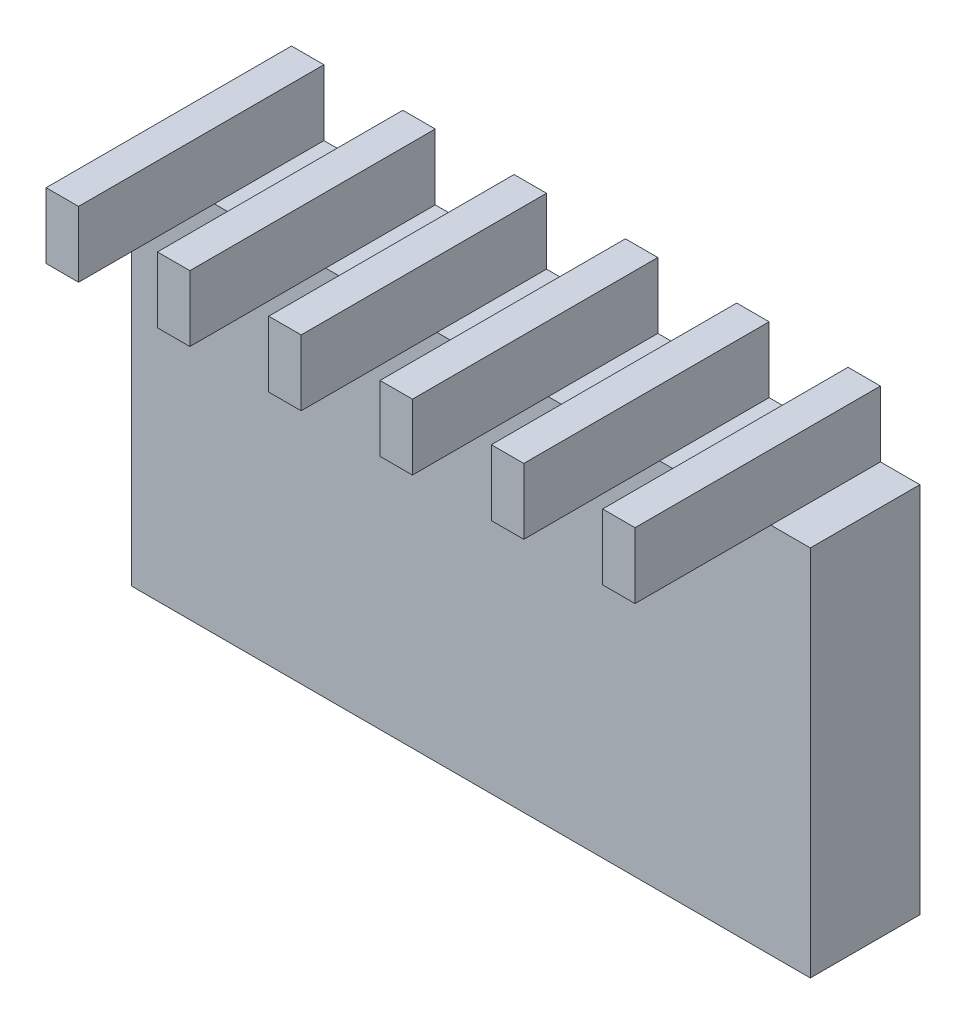
ISO-10303-21;
HEADER;
FILE_DESCRIPTION(('STEP AP214'),'2;1');
FILE_NAME('part.step','',(''),(''),'','','');
FILE_SCHEMA(('AUTOMOTIVE_DESIGN { 1 0 10303 214 1 1 1 1 }'));
ENDSEC;
DATA;
#1=APPLICATION_CONTEXT('core data for automotive mechanical design processes');
#2=APPLICATION_PROTOCOL_DEFINITION('international standard','automotive_design',2000,#1);
#3=PRODUCT_CONTEXT('',#1,'mechanical');
#4=PRODUCT('Part','Part','',(#3));
#5=PRODUCT_RELATED_PRODUCT_CATEGORY('part','',(#4));
#6=PRODUCT_DEFINITION_FORMATION('','',#4);
#7=PRODUCT_DEFINITION_CONTEXT('part definition',#1,'design');
#8=PRODUCT_DEFINITION('design','',#6,#7);
#9=PRODUCT_DEFINITION_SHAPE('','',#8);
#10=(LENGTH_UNIT() NAMED_UNIT(*) SI_UNIT(.MILLI.,.METRE.));
#11=(NAMED_UNIT(*) PLANE_ANGLE_UNIT() SI_UNIT($,.RADIAN.));
#12=(NAMED_UNIT(*) SI_UNIT($,.STERADIAN.) SOLID_ANGLE_UNIT());
#13=UNCERTAINTY_MEASURE_WITH_UNIT(LENGTH_MEASURE(1.E-05),#10,'distance_accuracy_value','');
#14=(GEOMETRIC_REPRESENTATION_CONTEXT(3) GLOBAL_UNCERTAINTY_ASSIGNED_CONTEXT((#13)) GLOBAL_UNIT_ASSIGNED_CONTEXT((#10,
#11,#12)) REPRESENTATION_CONTEXT('',''));
#15=CARTESIAN_POINT('',(0.,0.,0.));
#16=DIRECTION('',(0.,0.,1.));
#17=DIRECTION('',(1.,0.,0.));
#18=AXIS2_PLACEMENT_3D('',#15,#16,#17);
#19=CARTESIAN_POINT('',(-5.56782945736434,-4.20229978951269,2.5));
#20=DIRECTION('',(0.,1.,0.));
#21=DIRECTION('',(0.,0.,1.));
#22=AXIS2_PLACEMENT_3D('',#19,#20,#21);
#23=PLANE('',#22);
#24=DIRECTION('',(0.,0.,-1.));
#25=VECTOR('',#24,1.);
#26=CARTESIAN_POINT('',(9.92217054263566,-4.20229978951269,2.5));
#27=LINE('',#26,#25);
#28=CARTESIAN_POINT('',(9.92217054263566,-4.20229978951269,2.5));
#29=VERTEX_POINT('',#28);
#30=CARTESIAN_POINT('',(9.92217054263566,-4.20229978951269,0.));
#31=VERTEX_POINT('',#30);
#32=EDGE_CURVE('E277',#29,#31,#27,.T.);
#33=ORIENTED_EDGE('',*,*,#32,.F.);
#34=DIRECTION('',(1.,0.,0.));
#35=VECTOR('',#34,1.);
#36=CARTESIAN_POINT('',(-5.56782945736434,-4.20229978951269,2.5));
#37=LINE('',#36,#35);
#38=CARTESIAN_POINT('',(-5.56782945736434,-4.20229978951269,2.5));
#39=VERTEX_POINT('',#38);
#40=EDGE_CURVE('E276',#39,#29,#37,.T.);
#41=ORIENTED_EDGE('',*,*,#40,.F.);
#42=DIRECTION('',(0.,0.,-1.));
#43=VECTOR('',#42,1.);
#44=CARTESIAN_POINT('',(-5.56782945736434,-4.20229978951269,2.5));
#45=LINE('',#44,#43);
#46=CARTESIAN_POINT('',(-5.56782945736434,-4.20229978951269,0.));
#47=VERTEX_POINT('',#46);
#48=EDGE_CURVE('E52',#39,#47,#45,.T.);
#49=ORIENTED_EDGE('',*,*,#48,.T.);
#50=DIRECTION('',(1.,0.,0.));
#51=VECTOR('',#50,1.);
#52=CARTESIAN_POINT('',(-5.56782945736434,-4.20229978951269,0.));
#53=LINE('',#52,#51);
#54=EDGE_CURVE('E333',#47,#31,#53,.T.);
#55=ORIENTED_EDGE('',*,*,#54,.T.);
#56=EDGE_LOOP('',(#33,#41,#49,#55));
#57=FACE_BOUND('',#56,.T.);
#58=ADVANCED_FACE('F44',(#57),#23,.F.);
#59=CARTESIAN_POINT('',(0.,0.,2.5));
#60=DIRECTION('',(0.,0.,1.));
#61=DIRECTION('',(1.,0.,0.));
#62=AXIS2_PLACEMENT_3D('',#59,#60,#61);
#63=PLANE('',#62);
#64=ORIENTED_EDGE('',*,*,#40,.T.);
#65=DIRECTION('',(0.,1.,0.));
#66=VECTOR('',#65,1.);
#67=CARTESIAN_POINT('',(9.92217054263566,0.,2.5));
#68=LINE('',#67,#66);
#69=CARTESIAN_POINT('',(9.92217054263566,4.29770021048731,2.5));
#70=VERTEX_POINT('',#69);
#71=EDGE_CURVE('E263',#29,#70,#68,.T.);
#72=ORIENTED_EDGE('',*,*,#71,.T.);
#73=DIRECTION('',(1.,0.,0.));
#74=VECTOR('',#73,1.);
#75=CARTESIAN_POINT('',(0.,4.29770021048731,2.5));
#76=LINE('',#75,#74);
#77=CARTESIAN_POINT('',(9.02217054263566,4.29770021048731,2.5));
#78=VERTEX_POINT('',#77);
#79=EDGE_CURVE('E273',#78,#70,#76,.T.);
#80=ORIENTED_EDGE('',*,*,#79,.F.);
#81=DIRECTION('',(1.,0.,0.));
#82=VECTOR('',#81,1.);
#83=CARTESIAN_POINT('',(-4.41782945736434,4.29770021048731,2.5));
#84=LINE('',#83,#82);
#85=CARTESIAN_POINT('',(8.28217054263565,4.29770021048731,2.5));
#86=VERTEX_POINT('',#85);
#87=EDGE_CURVE('E283',#86,#78,#84,.T.);
#88=ORIENTED_EDGE('',*,*,#87,.F.);
#89=DIRECTION('',(1.,0.,0.));
#90=VECTOR('',#89,1.);
#91=CARTESIAN_POINT('',(0.,4.29770021048731,2.5));
#92=LINE('',#91,#90);
#93=CARTESIAN_POINT('',(6.48217054263566,4.29770021048731,2.5));
#94=VERTEX_POINT('',#93);
#95=EDGE_CURVE('E284',#94,#86,#92,.T.);
#96=ORIENTED_EDGE('',*,*,#95,.F.);
#97=CARTESIAN_POINT('',(5.74217054263565,4.29770021048731,2.5));
#98=VERTEX_POINT('',#97);
#99=EDGE_CURVE('E286',#98,#94,#84,.T.);
#100=ORIENTED_EDGE('',*,*,#99,.F.);
#101=DIRECTION('',(1.,0.,0.));
#102=VECTOR('',#101,1.);
#103=CARTESIAN_POINT('',(0.,4.29770021048731,2.5));
#104=LINE('',#103,#102);
#105=CARTESIAN_POINT('',(3.94217054263566,4.29770021048731,2.5));
#106=VERTEX_POINT('',#105);
#107=EDGE_CURVE('E289',#106,#98,#104,.T.);
#108=ORIENTED_EDGE('',*,*,#107,.F.);
#109=CARTESIAN_POINT('',(3.20217054263566,4.29770021048731,2.5));
#110=VERTEX_POINT('',#109);
#111=EDGE_CURVE('E419',#110,#106,#84,.T.);
#112=ORIENTED_EDGE('',*,*,#111,.F.);
#113=DIRECTION('',(1.,0.,0.));
#114=VECTOR('',#113,1.);
#115=CARTESIAN_POINT('',(0.,4.29770021048731,2.5));
#116=LINE('',#115,#114);
#117=CARTESIAN_POINT('',(1.40217054263566,4.29770021048731,2.5));
#118=VERTEX_POINT('',#117);
#119=EDGE_CURVE('E387',#118,#110,#116,.T.);
#120=ORIENTED_EDGE('',*,*,#119,.F.);
#121=CARTESIAN_POINT('',(0.662170542635655,4.29770021048731,2.5));
#122=VERTEX_POINT('',#121);
#123=EDGE_CURVE('E420',#122,#118,#84,.T.);
#124=ORIENTED_EDGE('',*,*,#123,.F.);
#125=DIRECTION('',(1.,0.,0.));
#126=VECTOR('',#125,1.);
#127=CARTESIAN_POINT('',(0.,4.29770021048731,2.5));
#128=LINE('',#127,#126);
#129=CARTESIAN_POINT('',(-1.13782945736434,4.29770021048731,2.5));
#130=VERTEX_POINT('',#129);
#131=EDGE_CURVE('E384',#130,#122,#128,.T.);
#132=ORIENTED_EDGE('',*,*,#131,.F.);
#133=CARTESIAN_POINT('',(-1.87782945736435,4.29770021048731,2.5));
#134=VERTEX_POINT('',#133);
#135=EDGE_CURVE('E306',#134,#130,#84,.T.);
#136=ORIENTED_EDGE('',*,*,#135,.F.);
#137=DIRECTION('',(1.,0.,0.));
#138=VECTOR('',#137,1.);
#139=CARTESIAN_POINT('',(0.,4.29770021048731,2.5));
#140=LINE('',#139,#138);
#141=CARTESIAN_POINT('',(-3.67782945736434,4.29770021048731,2.5));
#142=VERTEX_POINT('',#141);
#143=EDGE_CURVE('E382',#142,#134,#140,.T.);
#144=ORIENTED_EDGE('',*,*,#143,.F.);
#145=CARTESIAN_POINT('',(-4.41782945736434,4.29770021048731,2.5));
#146=VERTEX_POINT('',#145);
#147=EDGE_CURVE('E288',#146,#142,#84,.T.);
#148=ORIENTED_EDGE('',*,*,#147,.F.);
#149=DIRECTION('',(1.,0.,0.));
#150=VECTOR('',#149,1.);
#151=CARTESIAN_POINT('',(-5.56782945736434,4.29770021048731,2.5));
#152=LINE('',#151,#150);
#153=CARTESIAN_POINT('',(-5.56782945736434,4.29770021048731,2.5));
#154=VERTEX_POINT('',#153);
#155=EDGE_CURVE('E327',#154,#146,#152,.T.);
#156=ORIENTED_EDGE('',*,*,#155,.F.);
#157=DIRECTION('',(0.,-1.,0.));
#158=VECTOR('',#157,1.);
#159=CARTESIAN_POINT('',(-5.56782945736434,4.29770021048731,2.5));
#160=LINE('',#159,#158);
#161=EDGE_CURVE('E323',#154,#39,#160,.T.);
#162=ORIENTED_EDGE('',*,*,#161,.T.);
#163=EDGE_LOOP('',(#64,#72,#80,#88,#96,#100,#108,#112,#120,#124,#132,#136,#144,#148,#156,#162));
#164=FACE_BOUND('',#163,.T.);
#165=ADVANCED_FACE('F271',(#164),#63,.T.);
#166=CARTESIAN_POINT('',(0.,0.,0.));
#167=DIRECTION('',(0.,0.,1.));
#168=DIRECTION('',(1.,0.,0.));
#169=AXIS2_PLACEMENT_3D('',#166,#167,#168);
#170=PLANE('',#169);
#171=DIRECTION('',(0.,1.,0.));
#172=VECTOR('',#171,1.);
#173=CARTESIAN_POINT('',(9.92217054263566,0.,0.));
#174=LINE('',#173,#172);
#175=CARTESIAN_POINT('',(9.92217054263566,4.29770021048731,0.));
#176=VERTEX_POINT('',#175);
#177=EDGE_CURVE('E58',#31,#176,#174,.T.);
#178=ORIENTED_EDGE('',*,*,#177,.F.);
#179=ORIENTED_EDGE('',*,*,#54,.F.);
#180=DIRECTION('',(0.,-1.,0.));
#181=VECTOR('',#180,1.);
#182=CARTESIAN_POINT('',(-5.56782945736434,4.29770021048731,0.));
#183=LINE('',#182,#181);
#184=CARTESIAN_POINT('',(-5.56782945736434,4.29770021048731,0.));
#185=VERTEX_POINT('',#184);
#186=EDGE_CURVE('E322',#185,#47,#183,.T.);
#187=ORIENTED_EDGE('',*,*,#186,.F.);
#188=DIRECTION('',(1.,0.,0.));
#189=VECTOR('',#188,1.);
#190=CARTESIAN_POINT('',(-5.56782945736434,4.29770021048731,0.));
#191=LINE('',#190,#189);
#192=CARTESIAN_POINT('',(-4.41782945736434,4.29770021048731,0.));
#193=VERTEX_POINT('',#192);
#194=EDGE_CURVE('E325',#185,#193,#191,.T.);
#195=ORIENTED_EDGE('',*,*,#194,.T.);
#196=DIRECTION('',(0.,-1.,0.));
#197=VECTOR('',#196,1.);
#198=CARTESIAN_POINT('',(-4.41782945736434,5.79770021048731,0.));
#199=LINE('',#198,#197);
#200=CARTESIAN_POINT('',(-4.41782945736434,5.79770021048731,0.));
#201=VERTEX_POINT('',#200);
#202=EDGE_CURVE('E310',#201,#193,#199,.T.);
#203=ORIENTED_EDGE('',*,*,#202,.F.);
#204=DIRECTION('',(1.,0.,0.));
#205=VECTOR('',#204,1.);
#206=CARTESIAN_POINT('',(-4.41782945736434,5.79770021048731,0.));
#207=LINE('',#206,#205);
#208=CARTESIAN_POINT('',(-3.67782945736434,5.79770021048731,1.41893801610585E-13));
#209=VERTEX_POINT('',#208);
#210=EDGE_CURVE('E313',#201,#209,#207,.T.);
#211=ORIENTED_EDGE('',*,*,#210,.T.);
#212=DIRECTION('',(0.,1.,0.));
#213=VECTOR('',#212,1.);
#214=CARTESIAN_POINT('',(-3.67782945736434,4.29770021048731,1.41893801610585E-13));
#215=LINE('',#214,#213);
#216=CARTESIAN_POINT('',(-3.67782945736434,4.29770021048731,1.41893801610585E-13));
#217=VERTEX_POINT('',#216);
#218=EDGE_CURVE('E467',#217,#209,#215,.T.);
#219=ORIENTED_EDGE('',*,*,#218,.F.);
#220=DIRECTION('',(-1.,0.,0.));
#221=VECTOR('',#220,1.);
#222=CARTESIAN_POINT('',(-3.67782945736434,4.29770021048731,1.41893801610585E-13));
#223=LINE('',#222,#221);
#224=CARTESIAN_POINT('',(-1.87782945736435,4.29770021048731,1.41893801610585E-13));
#225=VERTEX_POINT('',#224);
#226=EDGE_CURVE('E368',#225,#217,#223,.T.);
#227=ORIENTED_EDGE('',*,*,#226,.F.);
#228=DIRECTION('',(0.,1.,0.));
#229=VECTOR('',#228,1.);
#230=CARTESIAN_POINT('',(-1.87782945736435,4.29770021048731,1.41893801610585E-13));
#231=LINE('',#230,#229);
#232=CARTESIAN_POINT('',(-1.87782945736435,5.79770021048731,1.41893801610585E-13));
#233=VERTEX_POINT('',#232);
#234=EDGE_CURVE('E472',#225,#233,#231,.T.);
#235=ORIENTED_EDGE('',*,*,#234,.T.);
#236=CARTESIAN_POINT('',(-1.13782945736434,5.79770021048731,1.24157076409262E-13));
#237=VERTEX_POINT('',#236);
#238=EDGE_CURVE('E317',#233,#237,#207,.T.);
#239=ORIENTED_EDGE('',*,*,#238,.T.);
#240=DIRECTION('',(0.,1.,0.));
#241=VECTOR('',#240,1.);
#242=CARTESIAN_POINT('',(-1.13782945736434,4.29770021048731,1.24157076409262E-13));
#243=LINE('',#242,#241);
#244=CARTESIAN_POINT('',(-1.13782945736434,4.29770021048731,1.24157076409262E-13));
#245=VERTEX_POINT('',#244);
#246=EDGE_CURVE('E453',#245,#237,#243,.T.);
#247=ORIENTED_EDGE('',*,*,#246,.F.);
#248=DIRECTION('',(-1.,0.,0.));
#249=VECTOR('',#248,1.);
#250=CARTESIAN_POINT('',(-1.13782945736434,4.29770021048731,1.24157076409262E-13));
#251=LINE('',#250,#249);
#252=CARTESIAN_POINT('',(0.662170542635655,4.29770021048731,1.24157076409262E-13));
#253=VERTEX_POINT('',#252);
#254=EDGE_CURVE('E464',#253,#245,#251,.T.);
#255=ORIENTED_EDGE('',*,*,#254,.F.);
#256=DIRECTION('',(0.,1.,0.));
#257=VECTOR('',#256,1.);
#258=CARTESIAN_POINT('',(0.662170542635655,4.29770021048731,1.24157076409262E-13));
#259=LINE('',#258,#257);
#260=CARTESIAN_POINT('',(0.662170542635655,5.79770021048731,1.24157076409262E-13));
#261=VERTEX_POINT('',#260);
#262=EDGE_CURVE('E362',#253,#261,#259,.T.);
#263=ORIENTED_EDGE('',*,*,#262,.T.);
#264=CARTESIAN_POINT('',(1.40217054263566,5.79770021048731,1.06420351207939E-13));
#265=VERTEX_POINT('',#264);
#266=EDGE_CURVE('E619',#261,#265,#207,.T.);
#267=ORIENTED_EDGE('',*,*,#266,.T.);
#268=DIRECTION('',(0.,1.,0.));
#269=VECTOR('',#268,1.);
#270=CARTESIAN_POINT('',(1.40217054263566,4.29770021048731,1.06420351207939E-13));
#271=LINE('',#270,#269);
#272=CARTESIAN_POINT('',(1.40217054263566,4.29770021048731,1.06420351207939E-13));
#273=VERTEX_POINT('',#272);
#274=EDGE_CURVE('E531',#273,#265,#271,.T.);
#275=ORIENTED_EDGE('',*,*,#274,.F.);
#276=DIRECTION('',(-1.,0.,0.));
#277=VECTOR('',#276,1.);
#278=CARTESIAN_POINT('',(1.40217054263566,4.29770021048731,1.06420351207939E-13));
#279=LINE('',#278,#277);
#280=CARTESIAN_POINT('',(3.20217054263566,4.29770021048731,1.06420351207939E-13));
#281=VERTEX_POINT('',#280);
#282=EDGE_CURVE('E544',#281,#273,#279,.T.);
#283=ORIENTED_EDGE('',*,*,#282,.F.);
#284=DIRECTION('',(0.,1.,0.));
#285=VECTOR('',#284,1.);
#286=CARTESIAN_POINT('',(3.20217054263566,4.29770021048731,1.06420351207939E-13));
#287=LINE('',#286,#285);
#288=CARTESIAN_POINT('',(3.20217054263566,5.79770021048731,1.06420351207939E-13));
#289=VERTEX_POINT('',#288);
#290=EDGE_CURVE('E539',#281,#289,#287,.T.);
#291=ORIENTED_EDGE('',*,*,#290,.T.);
#292=CARTESIAN_POINT('',(3.94217054263566,5.79770021048731,0.));
#293=VERTEX_POINT('',#292);
#294=EDGE_CURVE('E621',#289,#293,#207,.T.);
#295=ORIENTED_EDGE('',*,*,#294,.T.);
#296=DIRECTION('',(0.,1.,0.));
#297=VECTOR('',#296,1.);
#298=CARTESIAN_POINT('',(3.94217054263566,4.29770021048731,0.));
#299=LINE('',#298,#297);
#300=CARTESIAN_POINT('',(3.94217054263566,4.29770021048731,0.));
#301=VERTEX_POINT('',#300);
#302=EDGE_CURVE('E408',#301,#293,#299,.T.);
#303=ORIENTED_EDGE('',*,*,#302,.F.);
#304=DIRECTION('',(-1.,0.,0.));
#305=VECTOR('',#304,1.);
#306=CARTESIAN_POINT('',(3.94217054263566,4.29770021048731,0.));
#307=LINE('',#306,#305);
#308=CARTESIAN_POINT('',(5.74217054263565,4.29770021048731,0.));
#309=VERTEX_POINT('',#308);
#310=EDGE_CURVE('E527',#309,#301,#307,.T.);
#311=ORIENTED_EDGE('',*,*,#310,.F.);
#312=DIRECTION('',(0.,1.,0.));
#313=VECTOR('',#312,1.);
#314=CARTESIAN_POINT('',(5.74217054263565,4.29770021048731,0.));
#315=LINE('',#314,#313);
#316=CARTESIAN_POINT('',(5.74217054263565,5.79770021048731,0.));
#317=VERTEX_POINT('',#316);
#318=EDGE_CURVE('E406',#309,#317,#315,.T.);
#319=ORIENTED_EDGE('',*,*,#318,.T.);
#320=CARTESIAN_POINT('',(6.48217054263566,5.79770021048731,0.));
#321=VERTEX_POINT('',#320);
#322=EDGE_CURVE('E623',#317,#321,#207,.T.);
#323=ORIENTED_EDGE('',*,*,#322,.T.);
#324=DIRECTION('',(0.,1.,0.));
#325=VECTOR('',#324,1.);
#326=CARTESIAN_POINT('',(6.48217054263566,4.29770021048731,0.));
#327=LINE('',#326,#325);
#328=CARTESIAN_POINT('',(6.48217054263566,4.29770021048731,0.));
#329=VERTEX_POINT('',#328);
#330=EDGE_CURVE('E492',#329,#321,#327,.T.);
#331=ORIENTED_EDGE('',*,*,#330,.F.);
#332=DIRECTION('',(-1.,0.,0.));
#333=VECTOR('',#332,1.);
#334=CARTESIAN_POINT('',(6.48217054263566,4.29770021048731,0.));
#335=LINE('',#334,#333);
#336=CARTESIAN_POINT('',(8.28217054263565,4.29770021048731,0.));
#337=VERTEX_POINT('',#336);
#338=EDGE_CURVE('E506',#337,#329,#335,.T.);
#339=ORIENTED_EDGE('',*,*,#338,.F.);
#340=DIRECTION('',(0.,1.,0.));
#341=VECTOR('',#340,1.);
#342=CARTESIAN_POINT('',(8.28217054263565,4.29770021048731,0.));
#343=LINE('',#342,#341);
#344=CARTESIAN_POINT('',(8.28217054263565,5.79770021048731,0.));
#345=VERTEX_POINT('',#344);
#346=EDGE_CURVE('E500',#337,#345,#343,.T.);
#347=ORIENTED_EDGE('',*,*,#346,.T.);
#348=CARTESIAN_POINT('',(9.02217054263566,5.79770021048731,0.));
#349=VERTEX_POINT('',#348);
#350=EDGE_CURVE('E312',#345,#349,#207,.T.);
#351=ORIENTED_EDGE('',*,*,#350,.T.);
#352=DIRECTION('',(0.,1.,0.));
#353=VECTOR('',#352,1.);
#354=CARTESIAN_POINT('',(9.02217054263566,4.29770021048731,0.));
#355=LINE('',#354,#353);
#356=CARTESIAN_POINT('',(9.02217054263566,4.29770021048731,0.));
#357=VERTEX_POINT('',#356);
#358=EDGE_CURVE('E481',#357,#349,#355,.T.);
#359=ORIENTED_EDGE('',*,*,#358,.F.);
#360=DIRECTION('',(-1.,0.,0.));
#361=VECTOR('',#360,1.);
#362=CARTESIAN_POINT('',(9.02217054263566,4.29770021048731,0.));
#363=LINE('',#362,#361);
#364=EDGE_CURVE('E489',#176,#357,#363,.T.);
#365=ORIENTED_EDGE('',*,*,#364,.F.);
#366=EDGE_LOOP('',(#178,#179,#187,#195,#203,#211,#219,#227,#235,#239,#247,#255,#263,#267,#275,
#283,#291,#295,#303,#311,#319,#323,#331,#339,#347,#351,#359,#365));
#367=FACE_BOUND('',#366,.T.);
#368=ADVANCED_FACE('F346',(#367),#170,.F.);
#369=CARTESIAN_POINT('',(0.,4.29770021048731,0.));
#370=DIRECTION('',(0.,-1.,0.));
#371=DIRECTION('',(0.,0.,-1.));
#372=AXIS2_PLACEMENT_3D('',#369,#370,#371);
#373=PLANE('',#372);
#374=DIRECTION('',(0.,0.,1.));
#375=VECTOR('',#374,1.);
#376=CARTESIAN_POINT('',(9.92217054263566,4.29770021048731,0.));
#377=LINE('',#376,#375);
#378=EDGE_CURVE('E11',#176,#70,#377,.T.);
#379=ORIENTED_EDGE('',*,*,#378,.F.);
#380=ORIENTED_EDGE('',*,*,#364,.T.);
#381=DIRECTION('',(0.,0.,1.));
#382=VECTOR('',#381,1.);
#383=CARTESIAN_POINT('',(9.02217054263566,4.29770021048731,0.));
#384=LINE('',#383,#382);
#385=EDGE_CURVE('E282',#357,#78,#384,.T.);
#386=ORIENTED_EDGE('',*,*,#385,.T.);
#387=ORIENTED_EDGE('',*,*,#79,.T.);
#388=EDGE_LOOP('',(#379,#380,#386,#387));
#389=FACE_BOUND('',#388,.T.);
#390=ADVANCED_FACE('F280',(#389),#373,.F.);
#391=CARTESIAN_POINT('',(-4.41782945736434,5.79770021048731,2.5));
#392=DIRECTION('',(0.,1.,0.));
#393=DIRECTION('',(0.,0.,1.));
#394=AXIS2_PLACEMENT_3D('',#391,#392,#393);
#395=PLANE('',#394);
#396=DIRECTION('',(0.,0.,1.));
#397=VECTOR('',#396,1.);
#398=CARTESIAN_POINT('',(9.02217054263566,5.79770021048731,0.));
#399=LINE('',#398,#397);
#400=CARTESIAN_POINT('',(9.02217054263566,5.79770021048731,5.6));
#401=VERTEX_POINT('',#400);
#402=EDGE_CURVE('E385',#349,#401,#399,.T.);
#403=ORIENTED_EDGE('',*,*,#402,.F.);
#404=ORIENTED_EDGE('',*,*,#350,.F.);
#405=DIRECTION('',(0.,0.,-1.));
#406=VECTOR('',#405,1.);
#407=CARTESIAN_POINT('',(8.28217054263565,5.79770021048731,0.));
#408=LINE('',#407,#406);
#409=CARTESIAN_POINT('',(8.28217054263565,5.79770021048731,5.60000000000007));
#410=VERTEX_POINT('',#409);
#411=EDGE_CURVE('E504',#410,#345,#408,.T.);
#412=ORIENTED_EDGE('',*,*,#411,.F.);
#413=DIRECTION('',(-1.,0.,0.));
#414=VECTOR('',#413,1.);
#415=CARTESIAN_POINT('',(-4.41782945736434,5.79770021048731,5.6));
#416=LINE('',#415,#414);
#417=EDGE_CURVE('E303',#401,#410,#416,.T.);
#418=ORIENTED_EDGE('',*,*,#417,.F.);
#419=EDGE_LOOP('',(#403,#404,#412,#418));
#420=FACE_BOUND('',#419,.T.);
#421=ADVANCED_FACE('F594',(#420),#395,.T.);
#422=DIRECTION('',(0.,0.,1.));
#423=VECTOR('',#422,1.);
#424=CARTESIAN_POINT('',(6.48217054263566,5.79770021048731,0.));
#425=LINE('',#424,#423);
#426=CARTESIAN_POINT('',(6.48217054263566,5.79770021048731,5.6));
#427=VERTEX_POINT('',#426);
#428=EDGE_CURVE('E487',#321,#427,#425,.T.);
#429=ORIENTED_EDGE('',*,*,#428,.F.);
#430=ORIENTED_EDGE('',*,*,#322,.F.);
#431=DIRECTION('',(0.,0.,-1.));
#432=VECTOR('',#431,1.);
#433=CARTESIAN_POINT('',(5.74217054263565,5.79770021048731,0.));
#434=LINE('',#433,#432);
#435=CARTESIAN_POINT('',(5.74217054263565,5.79770021048731,5.60000000000009));
#436=VERTEX_POINT('',#435);
#437=EDGE_CURVE('E525',#436,#317,#434,.T.);
#438=ORIENTED_EDGE('',*,*,#437,.F.);
#439=EDGE_CURVE('E577',#427,#436,#416,.T.);
#440=ORIENTED_EDGE('',*,*,#439,.F.);
#441=EDGE_LOOP('',(#429,#430,#438,#440));
#442=FACE_BOUND('',#441,.T.);
#443=ADVANCED_FACE('F630',(#442),#395,.T.);
#444=DIRECTION('',(0.,0.,1.));
#445=VECTOR('',#444,1.);
#446=CARTESIAN_POINT('',(3.94217054263566,5.79770021048731,0.));
#447=LINE('',#446,#445);
#448=CARTESIAN_POINT('',(3.94217054263566,5.79770021048731,5.6));
#449=VERTEX_POINT('',#448);
#450=EDGE_CURVE('E503',#293,#449,#447,.T.);
#451=ORIENTED_EDGE('',*,*,#450,.F.);
#452=ORIENTED_EDGE('',*,*,#294,.F.);
#453=DIRECTION('',(0.,0.,-1.));
#454=VECTOR('',#453,1.);
#455=CARTESIAN_POINT('',(3.20217054263566,5.79770021048731,1.06420351207939E-13));
#456=LINE('',#455,#454);
#457=CARTESIAN_POINT('',(3.20217054263566,5.79770021048731,5.60000000000011));
#458=VERTEX_POINT('',#457);
#459=EDGE_CURVE('E542',#458,#289,#456,.T.);
#460=ORIENTED_EDGE('',*,*,#459,.F.);
#461=EDGE_CURVE('E573',#449,#458,#416,.T.);
#462=ORIENTED_EDGE('',*,*,#461,.F.);
#463=EDGE_LOOP('',(#451,#452,#460,#462));
#464=FACE_BOUND('',#463,.T.);
#465=ADVANCED_FACE('F698',(#464),#395,.T.);
#466=DIRECTION('',(0.,0.,1.));
#467=VECTOR('',#466,1.);
#468=CARTESIAN_POINT('',(1.40217054263566,5.79770021048731,1.06420351207939E-13));
#469=LINE('',#468,#467);
#470=CARTESIAN_POINT('',(1.40217054263566,5.79770021048731,5.6));
#471=VERTEX_POINT('',#470);
#472=EDGE_CURVE('E524',#265,#471,#469,.T.);
#473=ORIENTED_EDGE('',*,*,#472,.F.);
#474=ORIENTED_EDGE('',*,*,#266,.F.);
#475=DIRECTION('',(0.,0.,-1.));
#476=VECTOR('',#475,1.);
#477=CARTESIAN_POINT('',(0.662170542635655,5.79770021048731,1.24157076409262E-13));
#478=LINE('',#477,#476);
#479=CARTESIAN_POINT('',(0.662170542635655,5.79770021048731,5.60000000000012));
#480=VERTEX_POINT('',#479);
#481=EDGE_CURVE('E466',#480,#261,#478,.T.);
#482=ORIENTED_EDGE('',*,*,#481,.F.);
#483=EDGE_CURVE('E571',#471,#480,#416,.T.);
#484=ORIENTED_EDGE('',*,*,#483,.F.);
#485=EDGE_LOOP('',(#473,#474,#482,#484));
#486=FACE_BOUND('',#485,.T.);
#487=ADVANCED_FACE('F617',(#486),#395,.T.);
#488=DIRECTION('',(0.,0.,1.));
#489=VECTOR('',#488,1.);
#490=CARTESIAN_POINT('',(-1.13782945736434,5.79770021048731,1.24157076409262E-13));
#491=LINE('',#490,#489);
#492=CARTESIAN_POINT('',(-1.13782945736434,5.79770021048731,5.6));
#493=VERTEX_POINT('',#492);
#494=EDGE_CURVE('E461',#237,#493,#491,.T.);
#495=ORIENTED_EDGE('',*,*,#494,.F.);
#496=ORIENTED_EDGE('',*,*,#238,.F.);
#497=DIRECTION('',(0.,0.,-1.));
#498=VECTOR('',#497,1.);
#499=CARTESIAN_POINT('',(-1.87782945736435,5.79770021048731,1.41893801610585E-13));
#500=LINE('',#499,#498);
#501=CARTESIAN_POINT('',(-1.87782945736435,5.79770021048731,5.60000000000014));
#502=VERTEX_POINT('',#501);
#503=EDGE_CURVE('E363',#502,#233,#500,.T.);
#504=ORIENTED_EDGE('',*,*,#503,.F.);
#505=EDGE_CURVE('E302',#493,#502,#416,.T.);
#506=ORIENTED_EDGE('',*,*,#505,.F.);
#507=EDGE_LOOP('',(#495,#496,#504,#506));
#508=FACE_BOUND('',#507,.T.);
#509=ADVANCED_FACE('F570',(#508),#395,.T.);
#510=CARTESIAN_POINT('',(-4.41782945736434,4.29770021048731,5.6));
#511=DIRECTION('',(0.,1.,0.));
#512=DIRECTION('',(-1.,0.,0.));
#513=AXIS2_PLACEMENT_3D('',#510,#511,#512);
#514=PLANE('',#513);
#515=ORIENTED_EDGE('',*,*,#87,.T.);
#516=CARTESIAN_POINT('',(9.02217054263566,4.29770021048731,5.60000000000005));
#517=VERTEX_POINT('',#516);
#518=EDGE_CURVE('E483',#78,#517,#384,.T.);
#519=ORIENTED_EDGE('',*,*,#518,.T.);
#520=DIRECTION('',(1.,0.,0.));
#521=VECTOR('',#520,1.);
#522=CARTESIAN_POINT('',(-4.41782945736434,4.29770021048731,5.6));
#523=LINE('',#522,#521);
#524=CARTESIAN_POINT('',(8.28217054263565,4.29770021048731,5.60000000000007));
#525=VERTEX_POINT('',#524);
#526=EDGE_CURVE('E296',#525,#517,#523,.T.);
#527=ORIENTED_EDGE('',*,*,#526,.F.);
#528=DIRECTION('',(0.,0.,-1.));
#529=VECTOR('',#528,1.);
#530=CARTESIAN_POINT('',(8.28217054263565,4.29770021048731,0.));
#531=LINE('',#530,#529);
#532=EDGE_CURVE('E508',#525,#86,#531,.T.);
#533=ORIENTED_EDGE('',*,*,#532,.T.);
#534=EDGE_LOOP('',(#515,#519,#527,#533));
#535=FACE_BOUND('',#534,.T.);
#536=ADVANCED_FACE('F608',(#535),#514,.F.);
#537=ORIENTED_EDGE('',*,*,#99,.T.);
#538=DIRECTION('',(0.,0.,1.));
#539=VECTOR('',#538,1.);
#540=CARTESIAN_POINT('',(6.48217054263566,4.29770021048731,0.));
#541=LINE('',#540,#539);
#542=CARTESIAN_POINT('',(6.48217054263566,4.29770021048731,5.60000000000007));
#543=VERTEX_POINT('',#542);
#544=EDGE_CURVE('E511',#94,#543,#541,.T.);
#545=ORIENTED_EDGE('',*,*,#544,.T.);
#546=CARTESIAN_POINT('',(5.74217054263565,4.29770021048731,5.60000000000009));
#547=VERTEX_POINT('',#546);
#548=EDGE_CURVE('E416',#547,#543,#523,.T.);
#549=ORIENTED_EDGE('',*,*,#548,.F.);
#550=DIRECTION('',(0.,0.,-1.));
#551=VECTOR('',#550,1.);
#552=CARTESIAN_POINT('',(5.74217054263565,4.29770021048731,0.));
#553=LINE('',#552,#551);
#554=EDGE_CURVE('E403',#547,#98,#553,.T.);
#555=ORIENTED_EDGE('',*,*,#554,.T.);
#556=EDGE_LOOP('',(#537,#545,#549,#555));
#557=FACE_BOUND('',#556,.T.);
#558=ADVANCED_FACE('F413',(#557),#514,.F.);
#559=ORIENTED_EDGE('',*,*,#111,.T.);
#560=DIRECTION('',(0.,0.,1.));
#561=VECTOR('',#560,1.);
#562=CARTESIAN_POINT('',(3.94217054263566,4.29770021048731,0.));
#563=LINE('',#562,#561);
#564=CARTESIAN_POINT('',(3.94217054263566,4.29770021048731,5.60000000000009));
#565=VERTEX_POINT('',#564);
#566=EDGE_CURVE('E417',#106,#565,#563,.T.);
#567=ORIENTED_EDGE('',*,*,#566,.T.);
#568=CARTESIAN_POINT('',(3.20217054263566,4.29770021048731,5.60000000000011));
#569=VERTEX_POINT('',#568);
#570=EDGE_CURVE('E610',#569,#565,#523,.T.);
#571=ORIENTED_EDGE('',*,*,#570,.F.);
#572=DIRECTION('',(0.,0.,-1.));
#573=VECTOR('',#572,1.);
#574=CARTESIAN_POINT('',(3.20217054263566,4.29770021048731,1.06420351207939E-13));
#575=LINE('',#574,#573);
#576=EDGE_CURVE('E546',#569,#110,#575,.T.);
#577=ORIENTED_EDGE('',*,*,#576,.T.);
#578=EDGE_LOOP('',(#559,#567,#571,#577));
#579=FACE_BOUND('',#578,.T.);
#580=ADVANCED_FACE('F671',(#579),#514,.F.);
#581=ORIENTED_EDGE('',*,*,#123,.T.);
#582=DIRECTION('',(0.,0.,1.));
#583=VECTOR('',#582,1.);
#584=CARTESIAN_POINT('',(1.40217054263566,4.29770021048731,1.06420351207939E-13));
#585=LINE('',#584,#583);
#586=CARTESIAN_POINT('',(1.40217054263566,4.29770021048731,5.60000000000011));
#587=VERTEX_POINT('',#586);
#588=EDGE_CURVE('E548',#118,#587,#585,.T.);
#589=ORIENTED_EDGE('',*,*,#588,.T.);
#590=CARTESIAN_POINT('',(0.662170542635655,4.29770021048731,5.60000000000012));
#591=VERTEX_POINT('',#590);
#592=EDGE_CURVE('E458',#591,#587,#523,.T.);
#593=ORIENTED_EDGE('',*,*,#592,.F.);
#594=DIRECTION('',(0.,0.,-1.));
#595=VECTOR('',#594,1.);
#596=CARTESIAN_POINT('',(0.662170542635655,4.29770021048731,1.24157076409262E-13));
#597=LINE('',#596,#595);
#598=EDGE_CURVE('E450',#591,#122,#597,.T.);
#599=ORIENTED_EDGE('',*,*,#598,.T.);
#600=EDGE_LOOP('',(#581,#589,#593,#599));
#601=FACE_BOUND('',#600,.T.);
#602=ADVANCED_FACE('F456',(#601),#514,.F.);
#603=ORIENTED_EDGE('',*,*,#135,.T.);
#604=DIRECTION('',(0.,0.,1.));
#605=VECTOR('',#604,1.);
#606=CARTESIAN_POINT('',(-1.13782945736434,4.29770021048731,1.24157076409262E-13));
#607=LINE('',#606,#605);
#608=CARTESIAN_POINT('',(-1.13782945736434,4.29770021048731,5.60000000000012));
#609=VERTEX_POINT('',#608);
#610=EDGE_CURVE('E435',#130,#609,#607,.T.);
#611=ORIENTED_EDGE('',*,*,#610,.T.);
#612=CARTESIAN_POINT('',(-1.87782945736435,4.29770021048731,5.60000000000014));
#613=VERTEX_POINT('',#612);
#614=EDGE_CURVE('E301',#613,#609,#523,.T.);
#615=ORIENTED_EDGE('',*,*,#614,.F.);
#616=DIRECTION('',(0.,0.,-1.));
#617=VECTOR('',#616,1.);
#618=CARTESIAN_POINT('',(-1.87782945736435,4.29770021048731,1.41893801610585E-13));
#619=LINE('',#618,#617);
#620=EDGE_CURVE('E372',#613,#134,#619,.T.);
#621=ORIENTED_EDGE('',*,*,#620,.T.);
#622=EDGE_LOOP('',(#603,#611,#615,#621));
#623=FACE_BOUND('',#622,.T.);
#624=ADVANCED_FACE('F433',(#623),#514,.F.);
#625=CARTESIAN_POINT('',(0.,0.,5.6));
#626=DIRECTION('',(0.,0.,1.));
#627=DIRECTION('',(1.,0.,0.));
#628=AXIS2_PLACEMENT_3D('',#625,#626,#627);
#629=PLANE('',#628);
#630=DIRECTION('',(0.,1.,0.));
#631=VECTOR('',#630,1.);
#632=CARTESIAN_POINT('',(9.02217054263566,4.29770021048731,5.60000000000005));
#633=LINE('',#632,#631);
#634=EDGE_CURVE('E484',#517,#401,#633,.T.);
#635=ORIENTED_EDGE('',*,*,#634,.T.);
#636=ORIENTED_EDGE('',*,*,#417,.T.);
#637=DIRECTION('',(0.,1.,0.));
#638=VECTOR('',#637,1.);
#639=CARTESIAN_POINT('',(8.28217054263565,4.29770021048731,5.60000000000007));
#640=LINE('',#639,#638);
#641=EDGE_CURVE('E498',#525,#410,#640,.T.);
#642=ORIENTED_EDGE('',*,*,#641,.F.);
#643=ORIENTED_EDGE('',*,*,#526,.T.);
#644=EDGE_LOOP('',(#635,#636,#642,#643));
#645=FACE_BOUND('',#644,.T.);
#646=ADVANCED_FACE('F588',(#645),#629,.T.);
#647=DIRECTION('',(0.,1.,0.));
#648=VECTOR('',#647,1.);
#649=CARTESIAN_POINT('',(6.48217054263566,4.29770021048731,5.60000000000007));
#650=LINE('',#649,#648);
#651=EDGE_CURVE('E495',#543,#427,#650,.T.);
#652=ORIENTED_EDGE('',*,*,#651,.T.);
#653=ORIENTED_EDGE('',*,*,#439,.T.);
#654=DIRECTION('',(0.,1.,0.));
#655=VECTOR('',#654,1.);
#656=CARTESIAN_POINT('',(5.74217054263565,4.29770021048731,5.60000000000009));
#657=LINE('',#656,#655);
#658=EDGE_CURVE('E521',#547,#436,#657,.T.);
#659=ORIENTED_EDGE('',*,*,#658,.F.);
#660=ORIENTED_EDGE('',*,*,#548,.T.);
#661=EDGE_LOOP('',(#652,#653,#659,#660));
#662=FACE_BOUND('',#661,.T.);
#663=ADVANCED_FACE('F633',(#662),#629,.T.);
#664=DIRECTION('',(0.,1.,0.));
#665=VECTOR('',#664,1.);
#666=CARTESIAN_POINT('',(3.94217054263566,4.29770021048731,5.60000000000009));
#667=LINE('',#666,#665);
#668=EDGE_CURVE('E518',#565,#449,#667,.T.);
#669=ORIENTED_EDGE('',*,*,#668,.T.);
#670=ORIENTED_EDGE('',*,*,#461,.T.);
#671=DIRECTION('',(0.,1.,0.));
#672=VECTOR('',#671,1.);
#673=CARTESIAN_POINT('',(3.20217054263566,4.29770021048731,5.60000000000011));
#674=LINE('',#673,#672);
#675=EDGE_CURVE('E537',#569,#458,#674,.T.);
#676=ORIENTED_EDGE('',*,*,#675,.F.);
#677=ORIENTED_EDGE('',*,*,#570,.T.);
#678=EDGE_LOOP('',(#669,#670,#676,#677));
#679=FACE_BOUND('',#678,.T.);
#680=ADVANCED_FACE('F635',(#679),#629,.T.);
#681=DIRECTION('',(0.,1.,0.));
#682=VECTOR('',#681,1.);
#683=CARTESIAN_POINT('',(1.40217054263566,4.29770021048731,5.60000000000011));
#684=LINE('',#683,#682);
#685=EDGE_CURVE('E534',#587,#471,#684,.T.);
#686=ORIENTED_EDGE('',*,*,#685,.T.);
#687=ORIENTED_EDGE('',*,*,#483,.T.);
#688=DIRECTION('',(0.,1.,0.));
#689=VECTOR('',#688,1.);
#690=CARTESIAN_POINT('',(0.662170542635655,4.29770021048731,5.60000000000012));
#691=LINE('',#690,#689);
#692=EDGE_CURVE('E366',#591,#480,#691,.T.);
#693=ORIENTED_EDGE('',*,*,#692,.F.);
#694=ORIENTED_EDGE('',*,*,#592,.T.);
#695=EDGE_LOOP('',(#686,#687,#693,#694));
#696=FACE_BOUND('',#695,.T.);
#697=ADVANCED_FACE('F613',(#696),#629,.T.);
#698=DIRECTION('',(0.,1.,0.));
#699=VECTOR('',#698,1.);
#700=CARTESIAN_POINT('',(-1.13782945736434,4.29770021048731,5.60000000000012));
#701=LINE('',#700,#699);
#702=EDGE_CURVE('E555',#609,#493,#701,.T.);
#703=ORIENTED_EDGE('',*,*,#702,.T.);
#704=ORIENTED_EDGE('',*,*,#505,.T.);
#705=DIRECTION('',(0.,1.,0.));
#706=VECTOR('',#705,1.);
#707=CARTESIAN_POINT('',(-1.87782945736435,4.29770021048731,5.60000000000014));
#708=LINE('',#707,#706);
#709=EDGE_CURVE('E471',#613,#502,#708,.T.);
#710=ORIENTED_EDGE('',*,*,#709,.F.);
#711=ORIENTED_EDGE('',*,*,#614,.T.);
#712=EDGE_LOOP('',(#703,#704,#710,#711));
#713=FACE_BOUND('',#712,.T.);
#714=ADVANCED_FACE('F567',(#713),#629,.T.);
#715=CARTESIAN_POINT('',(-5.56782945736434,4.29770021048731,2.5));
#716=DIRECTION('',(0.,1.,0.));
#717=DIRECTION('',(-1.,0.,0.));
#718=AXIS2_PLACEMENT_3D('',#715,#716,#717);
#719=PLANE('',#718);
#720=ORIENTED_EDGE('',*,*,#155,.T.);
#721=DIRECTION('',(0.,0.,-1.));
#722=VECTOR('',#721,1.);
#723=CARTESIAN_POINT('',(-4.41782945736434,4.29770021048731,2.5));
#724=LINE('',#723,#722);
#725=EDGE_CURVE('E319',#146,#193,#724,.T.);
#726=ORIENTED_EDGE('',*,*,#725,.T.);
#727=ORIENTED_EDGE('',*,*,#194,.F.);
#728=DIRECTION('',(0.,0.,-1.));
#729=VECTOR('',#728,1.);
#730=CARTESIAN_POINT('',(-5.56782945736434,4.29770021048731,2.5));
#731=LINE('',#730,#729);
#732=EDGE_CURVE('E330',#154,#185,#731,.T.);
#733=ORIENTED_EDGE('',*,*,#732,.F.);
#734=EDGE_LOOP('',(#720,#726,#727,#733));
#735=FACE_BOUND('',#734,.T.);
#736=ADVANCED_FACE('F349',(#735),#719,.T.);
#737=CARTESIAN_POINT('',(-5.56782945736434,4.29770021048731,2.5));
#738=DIRECTION('',(1.,0.,0.));
#739=DIRECTION('',(0.,0.,-1.));
#740=AXIS2_PLACEMENT_3D('',#737,#738,#739);
#741=PLANE('',#740);
#742=ORIENTED_EDGE('',*,*,#186,.T.);
#743=ORIENTED_EDGE('',*,*,#48,.F.);
#744=ORIENTED_EDGE('',*,*,#161,.F.);
#745=ORIENTED_EDGE('',*,*,#732,.T.);
#746=EDGE_LOOP('',(#742,#743,#744,#745));
#747=FACE_BOUND('',#746,.T.);
#748=ADVANCED_FACE('F46',(#747),#741,.F.);
#749=CARTESIAN_POINT('',(-4.41782945736434,5.79770021048731,2.5));
#750=DIRECTION('',(1.,0.,0.));
#751=DIRECTION('',(0.,0.,-1.));
#752=AXIS2_PLACEMENT_3D('',#749,#750,#751);
#753=PLANE('',#752);
#754=ORIENTED_EDGE('',*,*,#202,.T.);
#755=ORIENTED_EDGE('',*,*,#725,.F.);
#756=DIRECTION('',(0.,0.,-1.));
#757=VECTOR('',#756,1.);
#758=CARTESIAN_POINT('',(-4.41782945736434,4.29770021048731,5.6));
#759=LINE('',#758,#757);
#760=CARTESIAN_POINT('',(-4.41782945736434,4.29770021048731,5.6));
#761=VERTEX_POINT('',#760);
#762=EDGE_CURVE('E307',#761,#146,#759,.T.);
#763=ORIENTED_EDGE('',*,*,#762,.F.);
#764=DIRECTION('',(0.,-1.,0.));
#765=VECTOR('',#764,1.);
#766=CARTESIAN_POINT('',(-4.41782945736434,5.79770021048731,5.6));
#767=LINE('',#766,#765);
#768=CARTESIAN_POINT('',(-4.41782945736434,5.79770021048731,5.6));
#769=VERTEX_POINT('',#768);
#770=EDGE_CURVE('E293',#769,#761,#767,.T.);
#771=ORIENTED_EDGE('',*,*,#770,.F.);
#772=DIRECTION('',(0.,0.,-1.));
#773=VECTOR('',#772,1.);
#774=CARTESIAN_POINT('',(-4.41782945736434,5.79770021048731,2.5));
#775=LINE('',#774,#773);
#776=EDGE_CURVE('E316',#769,#201,#775,.T.);
#777=ORIENTED_EDGE('',*,*,#776,.T.);
#778=EDGE_LOOP('',(#754,#755,#763,#771,#777));
#779=FACE_BOUND('',#778,.T.);
#780=ADVANCED_FACE('F354',(#779),#753,.F.);
#781=DIRECTION('',(0.,0.,1.));
#782=VECTOR('',#781,1.);
#783=CARTESIAN_POINT('',(-3.67782945736434,5.79770021048731,1.41893801610585E-13));
#784=LINE('',#783,#782);
#785=CARTESIAN_POINT('',(-3.67782945736434,5.79770021048731,5.6));
#786=VERTEX_POINT('',#785);
#787=EDGE_CURVE('E66',#209,#786,#784,.T.);
#788=ORIENTED_EDGE('',*,*,#787,.F.);
#789=ORIENTED_EDGE('',*,*,#210,.F.);
#790=ORIENTED_EDGE('',*,*,#776,.F.);
#791=EDGE_CURVE('E300',#786,#769,#416,.T.);
#792=ORIENTED_EDGE('',*,*,#791,.F.);
#793=EDGE_LOOP('',(#788,#789,#790,#792));
#794=FACE_BOUND('',#793,.T.);
#795=ADVANCED_FACE('F360',(#794),#395,.T.);
#796=ORIENTED_EDGE('',*,*,#147,.T.);
#797=DIRECTION('',(0.,0.,1.));
#798=VECTOR('',#797,1.);
#799=CARTESIAN_POINT('',(-3.67782945736434,4.29770021048731,1.41893801610585E-13));
#800=LINE('',#799,#798);
#801=CARTESIAN_POINT('',(-3.67782945736434,4.29770021048731,5.60000000000014));
#802=VERTEX_POINT('',#801);
#803=EDGE_CURVE('E375',#142,#802,#800,.T.);
#804=ORIENTED_EDGE('',*,*,#803,.T.);
#805=EDGE_CURVE('E297',#761,#802,#523,.T.);
#806=ORIENTED_EDGE('',*,*,#805,.F.);
#807=ORIENTED_EDGE('',*,*,#762,.T.);
#808=EDGE_LOOP('',(#796,#804,#806,#807));
#809=FACE_BOUND('',#808,.T.);
#810=ADVANCED_FACE('F658',(#809),#514,.F.);
#811=DIRECTION('',(0.,1.,0.));
#812=VECTOR('',#811,1.);
#813=CARTESIAN_POINT('',(-3.67782945736434,4.29770021048731,5.60000000000014));
#814=LINE('',#813,#812);
#815=EDGE_CURVE('E469',#802,#786,#814,.T.);
#816=ORIENTED_EDGE('',*,*,#815,.T.);
#817=ORIENTED_EDGE('',*,*,#791,.T.);
#818=ORIENTED_EDGE('',*,*,#770,.T.);
#819=ORIENTED_EDGE('',*,*,#805,.T.);
#820=EDGE_LOOP('',(#816,#817,#818,#819));
#821=FACE_BOUND('',#820,.T.);
#822=ADVANCED_FACE('F641',(#821),#629,.T.);
#823=CARTESIAN_POINT('',(-1.87782945736435,4.29770021048731,1.41893801610585E-13));
#824=DIRECTION('',(1.,0.,0.));
#825=DIRECTION('',(0.,0.,-1.));
#826=AXIS2_PLACEMENT_3D('',#823,#824,#825);
#827=PLANE('',#826);
#828=ORIENTED_EDGE('',*,*,#503,.T.);
#829=ORIENTED_EDGE('',*,*,#234,.F.);
#830=EDGE_CURVE('E376',#134,#225,#619,.T.);
#831=ORIENTED_EDGE('',*,*,#830,.F.);
#832=ORIENTED_EDGE('',*,*,#620,.F.);
#833=ORIENTED_EDGE('',*,*,#709,.T.);
#834=EDGE_LOOP('',(#828,#829,#831,#832,#833));
#835=FACE_BOUND('',#834,.T.);
#836=ADVANCED_FACE('F664',(#835),#827,.F.);
#837=CARTESIAN_POINT('',(-3.67782945736434,4.29770021048731,1.41893801610585E-13));
#838=DIRECTION('',(-1.,0.,0.));
#839=DIRECTION('',(0.,0.,1.));
#840=AXIS2_PLACEMENT_3D('',#837,#838,#839);
#841=PLANE('',#840);
#842=ORIENTED_EDGE('',*,*,#787,.T.);
#843=ORIENTED_EDGE('',*,*,#815,.F.);
#844=ORIENTED_EDGE('',*,*,#803,.F.);
#845=EDGE_CURVE('E377',#217,#142,#800,.T.);
#846=ORIENTED_EDGE('',*,*,#845,.F.);
#847=ORIENTED_EDGE('',*,*,#218,.T.);
#848=EDGE_LOOP('',(#842,#843,#844,#846,#847));
#849=FACE_BOUND('',#848,.T.);
#850=ADVANCED_FACE('F809',(#849),#841,.F.);
#851=CARTESIAN_POINT('',(0.,4.29770021048731,0.));
#852=DIRECTION('',(0.,-1.,0.));
#853=DIRECTION('',(0.,0.,-1.));
#854=AXIS2_PLACEMENT_3D('',#851,#852,#853);
#855=PLANE('',#854);
#856=ORIENTED_EDGE('',*,*,#143,.T.);
#857=ORIENTED_EDGE('',*,*,#830,.T.);
#858=ORIENTED_EDGE('',*,*,#226,.T.);
#859=ORIENTED_EDGE('',*,*,#845,.T.);
#860=EDGE_LOOP('',(#856,#857,#858,#859));
#861=FACE_BOUND('',#860,.T.);
#862=ADVANCED_FACE('F817',(#861),#855,.F.);
#863=CARTESIAN_POINT('',(0.662170542635655,4.29770021048731,1.24157076409262E-13));
#864=DIRECTION('',(1.,0.,0.));
#865=DIRECTION('',(0.,0.,-1.));
#866=AXIS2_PLACEMENT_3D('',#863,#864,#865);
#867=PLANE('',#866);
#868=ORIENTED_EDGE('',*,*,#481,.T.);
#869=ORIENTED_EDGE('',*,*,#262,.F.);
#870=EDGE_CURVE('E445',#122,#253,#597,.T.);
#871=ORIENTED_EDGE('',*,*,#870,.F.);
#872=ORIENTED_EDGE('',*,*,#598,.F.);
#873=ORIENTED_EDGE('',*,*,#692,.T.);
#874=EDGE_LOOP('',(#868,#869,#871,#872,#873));
#875=FACE_BOUND('',#874,.T.);
#876=ADVANCED_FACE('F449',(#875),#867,.F.);
#877=CARTESIAN_POINT('',(-1.13782945736434,4.29770021048731,1.24157076409262E-13));
#878=DIRECTION('',(-1.,0.,0.));
#879=DIRECTION('',(0.,0.,1.));
#880=AXIS2_PLACEMENT_3D('',#877,#878,#879);
#881=PLANE('',#880);
#882=ORIENTED_EDGE('',*,*,#494,.T.);
#883=ORIENTED_EDGE('',*,*,#702,.F.);
#884=ORIENTED_EDGE('',*,*,#610,.F.);
#885=EDGE_CURVE('E447',#245,#130,#607,.T.);
#886=ORIENTED_EDGE('',*,*,#885,.F.);
#887=ORIENTED_EDGE('',*,*,#246,.T.);
#888=EDGE_LOOP('',(#882,#883,#884,#886,#887));
#889=FACE_BOUND('',#888,.T.);
#890=ADVANCED_FACE('F561',(#889),#881,.F.);
#891=CARTESIAN_POINT('',(0.,4.29770021048731,0.));
#892=DIRECTION('',(0.,-1.,0.));
#893=DIRECTION('',(0.,0.,-1.));
#894=AXIS2_PLACEMENT_3D('',#891,#892,#893);
#895=PLANE('',#894);
#896=ORIENTED_EDGE('',*,*,#131,.T.);
#897=ORIENTED_EDGE('',*,*,#870,.T.);
#898=ORIENTED_EDGE('',*,*,#254,.T.);
#899=ORIENTED_EDGE('',*,*,#885,.T.);
#900=EDGE_LOOP('',(#896,#897,#898,#899));
#901=FACE_BOUND('',#900,.T.);
#902=ADVANCED_FACE('F443',(#901),#895,.F.);
#903=CARTESIAN_POINT('',(3.20217054263566,4.29770021048731,1.06420351207939E-13));
#904=DIRECTION('',(1.,0.,0.));
#905=DIRECTION('',(0.,0.,-1.));
#906=AXIS2_PLACEMENT_3D('',#903,#904,#905);
#907=PLANE('',#906);
#908=ORIENTED_EDGE('',*,*,#459,.T.);
#909=ORIENTED_EDGE('',*,*,#290,.F.);
#910=EDGE_CURVE('E533',#110,#281,#575,.T.);
#911=ORIENTED_EDGE('',*,*,#910,.F.);
#912=ORIENTED_EDGE('',*,*,#576,.F.);
#913=ORIENTED_EDGE('',*,*,#675,.T.);
#914=EDGE_LOOP('',(#908,#909,#911,#912,#913));
#915=FACE_BOUND('',#914,.T.);
#916=ADVANCED_FACE('F846',(#915),#907,.F.);
#917=CARTESIAN_POINT('',(1.40217054263566,4.29770021048731,1.06420351207939E-13));
#918=DIRECTION('',(-1.,0.,0.));
#919=DIRECTION('',(0.,0.,1.));
#920=AXIS2_PLACEMENT_3D('',#917,#918,#919);
#921=PLANE('',#920);
#922=ORIENTED_EDGE('',*,*,#472,.T.);
#923=ORIENTED_EDGE('',*,*,#685,.F.);
#924=ORIENTED_EDGE('',*,*,#588,.F.);
#925=EDGE_CURVE('E549',#273,#118,#585,.T.);
#926=ORIENTED_EDGE('',*,*,#925,.F.);
#927=ORIENTED_EDGE('',*,*,#274,.T.);
#928=EDGE_LOOP('',(#922,#923,#924,#926,#927));
#929=FACE_BOUND('',#928,.T.);
#930=ADVANCED_FACE('F854',(#929),#921,.F.);
#931=CARTESIAN_POINT('',(0.,4.29770021048731,0.));
#932=DIRECTION('',(0.,-1.,0.));
#933=DIRECTION('',(0.,0.,-1.));
#934=AXIS2_PLACEMENT_3D('',#931,#932,#933);
#935=PLANE('',#934);
#936=ORIENTED_EDGE('',*,*,#119,.T.);
#937=ORIENTED_EDGE('',*,*,#910,.T.);
#938=ORIENTED_EDGE('',*,*,#282,.T.);
#939=ORIENTED_EDGE('',*,*,#925,.T.);
#940=EDGE_LOOP('',(#936,#937,#938,#939));
#941=FACE_BOUND('',#940,.T.);
#942=ADVANCED_FACE('F863',(#941),#935,.F.);
#943=CARTESIAN_POINT('',(5.74217054263565,4.29770021048731,0.));
#944=DIRECTION('',(1.,0.,0.));
#945=DIRECTION('',(0.,0.,-1.));
#946=AXIS2_PLACEMENT_3D('',#943,#944,#945);
#947=PLANE('',#946);
#948=ORIENTED_EDGE('',*,*,#437,.T.);
#949=ORIENTED_EDGE('',*,*,#318,.F.);
#950=EDGE_CURVE('E394',#98,#309,#553,.T.);
#951=ORIENTED_EDGE('',*,*,#950,.F.);
#952=ORIENTED_EDGE('',*,*,#554,.F.);
#953=ORIENTED_EDGE('',*,*,#658,.T.);
#954=EDGE_LOOP('',(#948,#949,#951,#952,#953));
#955=FACE_BOUND('',#954,.T.);
#956=ADVANCED_FACE('F402',(#955),#947,.F.);
#957=CARTESIAN_POINT('',(3.94217054263566,4.29770021048731,0.));
#958=DIRECTION('',(-1.,0.,0.));
#959=DIRECTION('',(0.,0.,1.));
#960=AXIS2_PLACEMENT_3D('',#957,#958,#959);
#961=PLANE('',#960);
#962=ORIENTED_EDGE('',*,*,#450,.T.);
#963=ORIENTED_EDGE('',*,*,#668,.F.);
#964=ORIENTED_EDGE('',*,*,#566,.F.);
#965=EDGE_CURVE('E396',#301,#106,#563,.T.);
#966=ORIENTED_EDGE('',*,*,#965,.F.);
#967=ORIENTED_EDGE('',*,*,#302,.T.);
#968=EDGE_LOOP('',(#962,#963,#964,#966,#967));
#969=FACE_BOUND('',#968,.T.);
#970=ADVANCED_FACE('F880',(#969),#961,.F.);
#971=CARTESIAN_POINT('',(0.,4.29770021048731,0.));
#972=DIRECTION('',(0.,-1.,0.));
#973=DIRECTION('',(0.,0.,-1.));
#974=AXIS2_PLACEMENT_3D('',#971,#972,#973);
#975=PLANE('',#974);
#976=ORIENTED_EDGE('',*,*,#107,.T.);
#977=ORIENTED_EDGE('',*,*,#950,.T.);
#978=ORIENTED_EDGE('',*,*,#310,.T.);
#979=ORIENTED_EDGE('',*,*,#965,.T.);
#980=EDGE_LOOP('',(#976,#977,#978,#979));
#981=FACE_BOUND('',#980,.T.);
#982=ADVANCED_FACE('F392',(#981),#975,.F.);
#983=CARTESIAN_POINT('',(8.28217054263565,4.29770021048731,0.));
#984=DIRECTION('',(1.,0.,0.));
#985=DIRECTION('',(0.,0.,-1.));
#986=AXIS2_PLACEMENT_3D('',#983,#984,#985);
#987=PLANE('',#986);
#988=ORIENTED_EDGE('',*,*,#411,.T.);
#989=ORIENTED_EDGE('',*,*,#346,.F.);
#990=EDGE_CURVE('E494',#86,#337,#531,.T.);
#991=ORIENTED_EDGE('',*,*,#990,.F.);
#992=ORIENTED_EDGE('',*,*,#532,.F.);
#993=ORIENTED_EDGE('',*,*,#641,.T.);
#994=EDGE_LOOP('',(#988,#989,#991,#992,#993));
#995=FACE_BOUND('',#994,.T.);
#996=ADVANCED_FACE('F599',(#995),#987,.F.);
#997=CARTESIAN_POINT('',(6.48217054263566,4.29770021048731,0.));
#998=DIRECTION('',(-1.,0.,0.));
#999=DIRECTION('',(0.,0.,1.));
#1000=AXIS2_PLACEMENT_3D('',#997,#998,#999);
#1001=PLANE('',#1000);
#1002=ORIENTED_EDGE('',*,*,#428,.T.);
#1003=ORIENTED_EDGE('',*,*,#651,.F.);
#1004=ORIENTED_EDGE('',*,*,#544,.F.);
#1005=EDGE_CURVE('E512',#329,#94,#541,.T.);
#1006=ORIENTED_EDGE('',*,*,#1005,.F.);
#1007=ORIENTED_EDGE('',*,*,#330,.T.);
#1008=EDGE_LOOP('',(#1002,#1003,#1004,#1006,#1007));
#1009=FACE_BOUND('',#1008,.T.);
#1010=ADVANCED_FACE('F632',(#1009),#1001,.F.);
#1011=CARTESIAN_POINT('',(0.,4.29770021048731,0.));
#1012=DIRECTION('',(0.,-1.,0.));
#1013=DIRECTION('',(0.,0.,-1.));
#1014=AXIS2_PLACEMENT_3D('',#1011,#1012,#1013);
#1015=PLANE('',#1014);
#1016=ORIENTED_EDGE('',*,*,#95,.T.);
#1017=ORIENTED_EDGE('',*,*,#990,.T.);
#1018=ORIENTED_EDGE('',*,*,#338,.T.);
#1019=ORIENTED_EDGE('',*,*,#1005,.T.);
#1020=EDGE_LOOP('',(#1016,#1017,#1018,#1019));
#1021=FACE_BOUND('',#1020,.T.);
#1022=ADVANCED_FACE('F606',(#1021),#1015,.F.);
#1023=CARTESIAN_POINT('',(9.02217054263566,4.29770021048731,0.));
#1024=DIRECTION('',(-1.,0.,0.));
#1025=DIRECTION('',(0.,0.,1.));
#1026=AXIS2_PLACEMENT_3D('',#1023,#1024,#1025);
#1027=PLANE('',#1026);
#1028=ORIENTED_EDGE('',*,*,#402,.T.);
#1029=ORIENTED_EDGE('',*,*,#634,.F.);
#1030=ORIENTED_EDGE('',*,*,#518,.F.);
#1031=ORIENTED_EDGE('',*,*,#385,.F.);
#1032=ORIENTED_EDGE('',*,*,#358,.T.);
#1033=EDGE_LOOP('',(#1028,#1029,#1030,#1031,#1032));
#1034=FACE_BOUND('',#1033,.T.);
#1035=ADVANCED_FACE('F916',(#1034),#1027,.F.);
#1036=CARTESIAN_POINT('',(9.92217054263566,6.29770021048731,-1.48660850668467));
#1037=DIRECTION('',(1.,0.,0.));
#1038=DIRECTION('',(0.,0.,-1.));
#1039=AXIS2_PLACEMENT_3D('',#1036,#1037,#1038);
#1040=PLANE('',#1039);
#1041=ORIENTED_EDGE('',*,*,#32,.T.);
#1042=ORIENTED_EDGE('',*,*,#177,.T.);
#1043=ORIENTED_EDGE('',*,*,#378,.T.);
#1044=ORIENTED_EDGE('',*,*,#71,.F.);
#1045=EDGE_LOOP('',(#1041,#1042,#1043,#1044));
#1046=FACE_BOUND('',#1045,.T.);
#1047=ADVANCED_FACE('F262',(#1046),#1040,.T.);
#1048=CLOSED_SHELL('',(#58,#165,#368,#390,#421,#443,#465,#487,#509,#536,#558,#580,#602,#624,
#646,#663,#680,#697,#714,#736,#748,#780,#795,#810,#822,#836,#850,#862,#876,#890,#902,#916,#930,
#942,#956,#970,#982,#996,#1010,#1022,#1035,#1047));
#1049=MANIFOLD_SOLID_BREP('B2',#1048);
#1050=ADVANCED_BREP_SHAPE_REPRESENTATION('',(#18,#1049),#14);
#1051=SHAPE_DEFINITION_REPRESENTATION(#9,#1050);
ENDSEC;
END-ISO-10303-21;
